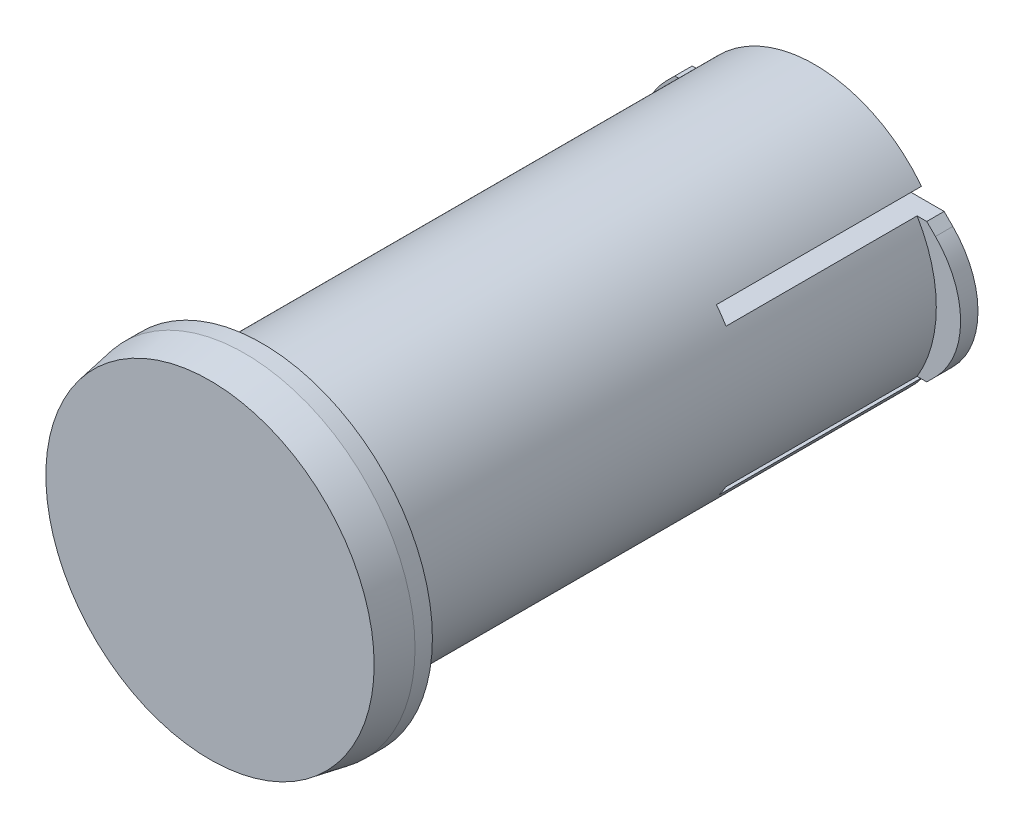
ISO-10303-21;
HEADER;
FILE_DESCRIPTION(('STEP AP214'),'2;1');
FILE_NAME('part.step','',(''),(''),'','','');
FILE_SCHEMA(('AUTOMOTIVE_DESIGN { 1 0 10303 214 1 1 1 1 }'));
ENDSEC;
DATA;
#1=APPLICATION_CONTEXT('core data for automotive mechanical design processes');
#2=APPLICATION_PROTOCOL_DEFINITION('international standard','automotive_design',2000,#1);
#3=PRODUCT_CONTEXT('',#1,'mechanical');
#4=PRODUCT('Part','Part','',(#3));
#5=PRODUCT_RELATED_PRODUCT_CATEGORY('part','',(#4));
#6=PRODUCT_DEFINITION_FORMATION('','',#4);
#7=PRODUCT_DEFINITION_CONTEXT('part definition',#1,'design');
#8=PRODUCT_DEFINITION('design','',#6,#7);
#9=PRODUCT_DEFINITION_SHAPE('','',#8);
#10=(LENGTH_UNIT() NAMED_UNIT(*) SI_UNIT(.MILLI.,.METRE.));
#11=(NAMED_UNIT(*) PLANE_ANGLE_UNIT() SI_UNIT($,.RADIAN.));
#12=(NAMED_UNIT(*) SI_UNIT($,.STERADIAN.) SOLID_ANGLE_UNIT());
#13=UNCERTAINTY_MEASURE_WITH_UNIT(LENGTH_MEASURE(1.E-05),#10,'distance_accuracy_value','');
#14=(GEOMETRIC_REPRESENTATION_CONTEXT(3) GLOBAL_UNCERTAINTY_ASSIGNED_CONTEXT((#13)) GLOBAL_UNIT_ASSIGNED_CONTEXT((#10,
#11,#12)) REPRESENTATION_CONTEXT('',''));
#15=CARTESIAN_POINT('',(0.,0.,0.));
#16=DIRECTION('',(0.,0.,1.));
#17=DIRECTION('',(1.,0.,0.));
#18=AXIS2_PLACEMENT_3D('',#15,#16,#17);
#19=CARTESIAN_POINT('',(0.,0.,-16.));
#20=DIRECTION('',(0.,0.,1.));
#21=DIRECTION('',(1.,0.,0.));
#22=AXIS2_PLACEMENT_3D('',#19,#20,#21);
#23=CYLINDRICAL_SURFACE('',#22,3.9);
#24=DIRECTION('',(0.,0.,1.));
#25=VECTOR('',#24,1.);
#26=CARTESIAN_POINT('',(-3.34813380855664,-2.,-16.));
#27=LINE('',#26,#25);
#28=CARTESIAN_POINT('',(-3.34813380855664,-2.,-10.));
#29=VERTEX_POINT('',#28);
#30=CARTESIAN_POINT('',(-3.34813380855664,-2.,-15.5));
#31=VERTEX_POINT('',#30);
#32=EDGE_CURVE('E269',#29,#31,#27,.F.);
#33=ORIENTED_EDGE('',*,*,#32,.F.);
#34=CARTESIAN_POINT('',(0.,0.,-10.));
#35=DIRECTION('',(0.,0.,-1.));
#36=DIRECTION('',(-1.,0.,0.));
#37=AXIS2_PLACEMENT_3D('',#34,#35,#36);
#38=CIRCLE('',#37,3.9);
#39=CARTESIAN_POINT('',(-3.14960314960473,-2.3,-10.));
#40=VERTEX_POINT('',#39);
#41=EDGE_CURVE('E11',#29,#40,#38,.F.);
#42=ORIENTED_EDGE('',*,*,#41,.T.);
#43=DIRECTION('',(0.,0.,1.));
#44=VECTOR('',#43,1.);
#45=CARTESIAN_POINT('',(-3.14960314960473,-2.3,-16.));
#46=LINE('',#45,#44);
#47=CARTESIAN_POINT('',(-3.14960314960473,-2.3,-15.9));
#48=VERTEX_POINT('',#47);
#49=EDGE_CURVE('E283',#40,#48,#46,.F.);
#50=ORIENTED_EDGE('',*,*,#49,.T.);
#51=CARTESIAN_POINT('',(0.,0.,-15.9));
#52=DIRECTION('',(0.,0.,-1.));
#53=DIRECTION('',(-1.,0.,0.));
#54=AXIS2_PLACEMENT_3D('',#51,#52,#53);
#55=CIRCLE('',#54,3.9);
#56=CARTESIAN_POINT('',(3.14960314960473,-2.3,-15.9));
#57=VERTEX_POINT('',#56);
#58=EDGE_CURVE('E417',#57,#48,#55,.T.);
#59=ORIENTED_EDGE('',*,*,#58,.F.);
#60=DIRECTION('',(0.,0.,1.));
#61=VECTOR('',#60,1.);
#62=CARTESIAN_POINT('',(3.14960314960473,-2.3,-16.));
#63=LINE('',#62,#61);
#64=CARTESIAN_POINT('',(3.14960314960473,-2.3,-10.));
#65=VERTEX_POINT('',#64);
#66=EDGE_CURVE('E363',#65,#57,#63,.F.);
#67=ORIENTED_EDGE('',*,*,#66,.F.);
#68=CARTESIAN_POINT('',(0.,0.,-10.));
#69=DIRECTION('',(0.,0.,-1.));
#70=DIRECTION('',(-1.,0.,0.));
#71=AXIS2_PLACEMENT_3D('',#68,#69,#70);
#72=CIRCLE('',#71,3.9);
#73=CARTESIAN_POINT('',(3.34813380855664,-2.,-10.));
#74=VERTEX_POINT('',#73);
#75=EDGE_CURVE('E447',#65,#74,#72,.F.);
#76=ORIENTED_EDGE('',*,*,#75,.T.);
#77=DIRECTION('',(0.,0.,1.));
#78=VECTOR('',#77,1.);
#79=CARTESIAN_POINT('',(3.34813380855664,-2.,-16.));
#80=LINE('',#79,#78);
#81=CARTESIAN_POINT('',(3.34813380855664,-2.,-15.5));
#82=VERTEX_POINT('',#81);
#83=EDGE_CURVE('E353',#74,#82,#80,.F.);
#84=ORIENTED_EDGE('',*,*,#83,.T.);
#85=CARTESIAN_POINT('',(0.,0.,-15.5));
#86=DIRECTION('',(0.,0.,-1.));
#87=DIRECTION('',(-1.,0.,0.));
#88=AXIS2_PLACEMENT_3D('',#85,#86,#87);
#89=CIRCLE('',#88,3.9);
#90=CARTESIAN_POINT('',(3.34813380855664,2.,-15.5));
#91=VERTEX_POINT('',#90);
#92=EDGE_CURVE('E436',#82,#91,#89,.F.);
#93=ORIENTED_EDGE('',*,*,#92,.T.);
#94=DIRECTION('',(0.,0.,1.));
#95=VECTOR('',#94,1.);
#96=CARTESIAN_POINT('',(3.34813380855664,2.,-16.));
#97=LINE('',#96,#95);
#98=CARTESIAN_POINT('',(3.34813380855664,2.,-10.));
#99=VERTEX_POINT('',#98);
#100=EDGE_CURVE('E349',#99,#91,#97,.F.);
#101=ORIENTED_EDGE('',*,*,#100,.F.);
#102=CARTESIAN_POINT('',(3.07408522978788,2.4,-10.));
#103=VERTEX_POINT('',#102);
#104=EDGE_CURVE('E444',#99,#103,#72,.F.);
#105=ORIENTED_EDGE('',*,*,#104,.T.);
#106=DIRECTION('',(0.,0.,1.));
#107=VECTOR('',#106,1.);
#108=CARTESIAN_POINT('',(3.07408522978788,2.4,-16.));
#109=LINE('',#108,#107);
#110=CARTESIAN_POINT('',(3.07408522978788,2.4,-15.9));
#111=VERTEX_POINT('',#110);
#112=EDGE_CURVE('E365',#103,#111,#109,.F.);
#113=ORIENTED_EDGE('',*,*,#112,.T.);
#114=CARTESIAN_POINT('',(-3.07408522978788,2.4,-15.9));
#115=VERTEX_POINT('',#114);
#116=EDGE_CURVE('E416',#115,#111,#55,.T.);
#117=ORIENTED_EDGE('',*,*,#116,.F.);
#118=DIRECTION('',(0.,0.,1.));
#119=VECTOR('',#118,1.);
#120=CARTESIAN_POINT('',(-3.07408522978788,2.4,-16.));
#121=LINE('',#120,#119);
#122=CARTESIAN_POINT('',(-3.07408522978788,2.4,-10.));
#123=VERTEX_POINT('',#122);
#124=EDGE_CURVE('E281',#123,#115,#121,.F.);
#125=ORIENTED_EDGE('',*,*,#124,.F.);
#126=CARTESIAN_POINT('',(-3.34813380855664,2.,-10.));
#127=VERTEX_POINT('',#126);
#128=EDGE_CURVE('E50',#123,#127,#38,.F.);
#129=ORIENTED_EDGE('',*,*,#128,.T.);
#130=DIRECTION('',(0.,0.,1.));
#131=VECTOR('',#130,1.);
#132=CARTESIAN_POINT('',(-3.34813380855664,2.,-16.));
#133=LINE('',#132,#131);
#134=CARTESIAN_POINT('',(-3.34813380855664,2.,-15.5));
#135=VERTEX_POINT('',#134);
#136=EDGE_CURVE('E272',#127,#135,#133,.F.);
#137=ORIENTED_EDGE('',*,*,#136,.T.);
#138=CARTESIAN_POINT('',(0.,0.,-15.5));
#139=DIRECTION('',(0.,0.,-1.));
#140=DIRECTION('',(-1.,0.,0.));
#141=AXIS2_PLACEMENT_3D('',#138,#139,#140);
#142=CIRCLE('',#141,3.9);
#143=EDGE_CURVE('E448',#135,#31,#142,.F.);
#144=ORIENTED_EDGE('',*,*,#143,.T.);
#145=EDGE_LOOP('',(#33,#42,#50,#59,#67,#76,#84,#93,#101,#105,#113,#117,#125,#129,#137,#144));
#146=FACE_BOUND('',#145,.T.);
#147=CARTESIAN_POINT('',(0.,0.,0.));
#148=DIRECTION('',(0.,0.,1.));
#149=DIRECTION('',(1.,0.,0.));
#150=AXIS2_PLACEMENT_3D('',#147,#148,#149);
#151=CIRCLE('',#150,3.9);
#152=CARTESIAN_POINT('',(3.9,0.,0.));
#153=VERTEX_POINT('',#152);
#154=EDGE_CURVE('E424',#153,#153,#151,.T.);
#155=ORIENTED_EDGE('',*,*,#154,.F.);
#156=EDGE_LOOP('',(#155));
#157=FACE_BOUND('',#156,.T.);
#158=ADVANCED_FACE('F45',(#146,#157),#23,.T.);
#159=CARTESIAN_POINT('',(0.,0.,-15.9));
#160=DIRECTION('',(0.,0.,-1.));
#161=DIRECTION('',(-1.,0.,0.));
#162=AXIS2_PLACEMENT_3D('',#159,#160,#161);
#163=PLANE('',#162);
#164=ORIENTED_EDGE('',*,*,#58,.T.);
#165=DIRECTION('',(1.,0.,0.));
#166=VECTOR('',#165,1.);
#167=CARTESIAN_POINT('',(0.,-2.3,-15.9));
#168=LINE('',#167,#166);
#169=CARTESIAN_POINT('',(-1.2,-2.3,-15.9));
#170=VERTEX_POINT('',#169);
#171=EDGE_CURVE('E451',#48,#170,#168,.T.);
#172=ORIENTED_EDGE('',*,*,#171,.T.);
#173=DIRECTION('',(0.,-1.,0.));
#174=VECTOR('',#173,1.);
#175=CARTESIAN_POINT('',(-1.2,0.,-15.9));
#176=LINE('',#175,#174);
#177=CARTESIAN_POINT('',(-1.2,-1.6,-15.9));
#178=VERTEX_POINT('',#177);
#179=EDGE_CURVE('E277',#178,#170,#176,.T.);
#180=ORIENTED_EDGE('',*,*,#179,.F.);
#181=CARTESIAN_POINT('',(0.,0.,-15.9));
#182=DIRECTION('',(0.,0.,-1.));
#183=DIRECTION('',(-1.,0.,0.));
#184=AXIS2_PLACEMENT_3D('',#181,#182,#183);
#185=CIRCLE('',#184,2.);
#186=CARTESIAN_POINT('',(1.2,-1.6,-15.9));
#187=VERTEX_POINT('',#186);
#188=EDGE_CURVE('E413',#187,#178,#185,.T.);
#189=ORIENTED_EDGE('',*,*,#188,.F.);
#190=DIRECTION('',(0.,-1.,0.));
#191=VECTOR('',#190,1.);
#192=CARTESIAN_POINT('',(1.2,0.,-15.9));
#193=LINE('',#192,#191);
#194=CARTESIAN_POINT('',(1.2,-2.3,-15.9));
#195=VERTEX_POINT('',#194);
#196=EDGE_CURVE('E355',#187,#195,#193,.T.);
#197=ORIENTED_EDGE('',*,*,#196,.T.);
#198=DIRECTION('',(-1.,0.,0.));
#199=VECTOR('',#198,1.);
#200=CARTESIAN_POINT('',(0.,-2.3,-15.9));
#201=LINE('',#200,#199);
#202=EDGE_CURVE('E439',#57,#195,#201,.T.);
#203=ORIENTED_EDGE('',*,*,#202,.F.);
#204=EDGE_LOOP('',(#164,#172,#180,#189,#197,#203));
#205=FACE_BOUND('',#204,.T.);
#206=ADVANCED_FACE('F500',(#205),#163,.T.);
#207=CARTESIAN_POINT('',(0.,0.,-19.1));
#208=DIRECTION('',(0.,0.,1.));
#209=DIRECTION('',(1.,0.,0.));
#210=AXIS2_PLACEMENT_3D('',#207,#208,#209);
#211=CYLINDRICAL_SURFACE('',#210,2.);
#212=CARTESIAN_POINT('',(0.,0.,-16.));
#213=DIRECTION('',(0.,0.,1.));
#214=DIRECTION('',(1.,0.,0.));
#215=AXIS2_PLACEMENT_3D('',#212,#213,#214);
#216=CIRCLE('',#215,2.);
#217=CARTESIAN_POINT('',(-1.2,1.6,-16.));
#218=VERTEX_POINT('',#217);
#219=CARTESIAN_POINT('',(1.2,1.6,-16.));
#220=VERTEX_POINT('',#219);
#221=EDGE_CURVE('E420',#218,#220,#216,.F.);
#222=ORIENTED_EDGE('',*,*,#221,.F.);
#223=DIRECTION('',(0.,0.,1.));
#224=VECTOR('',#223,1.);
#225=CARTESIAN_POINT('',(-1.2,1.6,-19.1));
#226=LINE('',#225,#224);
#227=CARTESIAN_POINT('',(-1.2,1.6,-15.9));
#228=VERTEX_POINT('',#227);
#229=EDGE_CURVE('E61',#218,#228,#226,.T.);
#230=ORIENTED_EDGE('',*,*,#229,.T.);
#231=CARTESIAN_POINT('',(1.2,1.6,-15.9));
#232=VERTEX_POINT('',#231);
#233=EDGE_CURVE('E403',#228,#232,#185,.T.);
#234=ORIENTED_EDGE('',*,*,#233,.T.);
#235=DIRECTION('',(0.,0.,1.));
#236=VECTOR('',#235,1.);
#237=CARTESIAN_POINT('',(1.2,1.6,-19.1));
#238=LINE('',#237,#236);
#239=EDGE_CURVE('E360',#220,#232,#238,.T.);
#240=ORIENTED_EDGE('',*,*,#239,.F.);
#241=EDGE_LOOP('',(#222,#230,#234,#240));
#242=FACE_BOUND('',#241,.T.);
#243=ADVANCED_FACE('F467',(#242),#211,.T.);
#244=CARTESIAN_POINT('',(-1.2,2.4,-15.9));
#245=VERTEX_POINT('',#244);
#246=EDGE_CURVE('E279',#245,#228,#176,.T.);
#247=ORIENTED_EDGE('',*,*,#246,.F.);
#248=DIRECTION('',(1.,0.,0.));
#249=VECTOR('',#248,1.);
#250=CARTESIAN_POINT('',(0.,2.4,-15.9));
#251=LINE('',#250,#249);
#252=EDGE_CURVE('E249',#115,#245,#251,.T.);
#253=ORIENTED_EDGE('',*,*,#252,.F.);
#254=ORIENTED_EDGE('',*,*,#116,.T.);
#255=DIRECTION('',(-1.,0.,0.));
#256=VECTOR('',#255,1.);
#257=CARTESIAN_POINT('',(0.,2.4,-15.9));
#258=LINE('',#257,#256);
#259=CARTESIAN_POINT('',(1.2,2.4,-15.9));
#260=VERTEX_POINT('',#259);
#261=EDGE_CURVE('E441',#111,#260,#258,.T.);
#262=ORIENTED_EDGE('',*,*,#261,.T.);
#263=EDGE_CURVE('E358',#260,#232,#193,.T.);
#264=ORIENTED_EDGE('',*,*,#263,.T.);
#265=ORIENTED_EDGE('',*,*,#233,.F.);
#266=EDGE_LOOP('',(#247,#253,#254,#262,#264,#265));
#267=FACE_BOUND('',#266,.T.);
#268=ADVANCED_FACE('F461',(#267),#163,.T.);
#269=ORIENTED_EDGE('',*,*,#188,.T.);
#270=DIRECTION('',(0.,0.,1.));
#271=VECTOR('',#270,1.);
#272=CARTESIAN_POINT('',(-1.2,-1.6,-19.1));
#273=LINE('',#272,#271);
#274=CARTESIAN_POINT('',(-1.2,-1.6,-16.));
#275=VERTEX_POINT('',#274);
#276=EDGE_CURVE('E274',#178,#275,#273,.F.);
#277=ORIENTED_EDGE('',*,*,#276,.T.);
#278=CARTESIAN_POINT('',(1.2,-1.6,-16.));
#279=VERTEX_POINT('',#278);
#280=EDGE_CURVE('E425',#279,#275,#216,.F.);
#281=ORIENTED_EDGE('',*,*,#280,.F.);
#282=DIRECTION('',(0.,0.,1.));
#283=VECTOR('',#282,1.);
#284=CARTESIAN_POINT('',(1.2,-1.6,-19.1));
#285=LINE('',#284,#283);
#286=EDGE_CURVE('E69',#187,#279,#285,.F.);
#287=ORIENTED_EDGE('',*,*,#286,.F.);
#288=EDGE_LOOP('',(#269,#277,#281,#287));
#289=FACE_BOUND('',#288,.T.);
#290=ADVANCED_FACE('F503',(#289),#211,.T.);
#291=CARTESIAN_POINT('',(0.,0.,-16.));
#292=DIRECTION('',(0.,0.,1.));
#293=DIRECTION('',(1.,0.,0.));
#294=AXIS2_PLACEMENT_3D('',#291,#292,#293);
#295=PLANE('',#294);
#296=ORIENTED_EDGE('',*,*,#280,.T.);
#297=DIRECTION('',(0.,-1.,0.));
#298=VECTOR('',#297,1.);
#299=CARTESIAN_POINT('',(-1.2,2.4,-16.));
#300=LINE('',#299,#298);
#301=EDGE_CURVE('E243',#218,#275,#300,.T.);
#302=ORIENTED_EDGE('',*,*,#301,.F.);
#303=ORIENTED_EDGE('',*,*,#221,.T.);
#304=DIRECTION('',(0.,-1.,0.));
#305=VECTOR('',#304,1.);
#306=CARTESIAN_POINT('',(1.2,2.4,-16.));
#307=LINE('',#306,#305);
#308=EDGE_CURVE('E314',#220,#279,#307,.T.);
#309=ORIENTED_EDGE('',*,*,#308,.T.);
#310=EDGE_LOOP('',(#296,#302,#303,#309));
#311=FACE_BOUND('',#310,.T.);
#312=ADVANCED_FACE('F470',(#311),#295,.F.);
#313=CARTESIAN_POINT('',(0.,0.,1.5));
#314=DIRECTION('',(0.,0.,-1.));
#315=DIRECTION('',(-1.,0.,0.));
#316=AXIS2_PLACEMENT_3D('',#313,#314,#315);
#317=CYLINDRICAL_SURFACE('',#316,4.9);
#318=CARTESIAN_POINT('',(0.,0.,0.499999999999933));
#319=DIRECTION('',(0.,0.,1.));
#320=DIRECTION('',(1.,0.,0.));
#321=AXIS2_PLACEMENT_3D('',#318,#319,#320);
#322=CIRCLE('',#321,4.9);
#323=CARTESIAN_POINT('',(4.9,0.,0.499999999999933));
#324=VERTEX_POINT('',#323);
#325=EDGE_CURVE('E433',#324,#324,#322,.F.);
#326=ORIENTED_EDGE('',*,*,#325,.T.);
#327=EDGE_LOOP('',(#326));
#328=FACE_BOUND('',#327,.T.);
#329=CARTESIAN_POINT('',(0.,0.,0.));
#330=DIRECTION('',(0.,0.,1.));
#331=DIRECTION('',(1.,0.,0.));
#332=AXIS2_PLACEMENT_3D('',#329,#330,#331);
#333=CIRCLE('',#332,4.9);
#334=CARTESIAN_POINT('',(4.9,0.,0.));
#335=VERTEX_POINT('',#334);
#336=EDGE_CURVE('E421',#335,#335,#333,.T.);
#337=ORIENTED_EDGE('',*,*,#336,.T.);
#338=EDGE_LOOP('',(#337));
#339=FACE_BOUND('',#338,.T.);
#340=ADVANCED_FACE('F556',(#328,#339),#317,.T.);
#341=CARTESIAN_POINT('',(0.,0.,1.5));
#342=DIRECTION('',(0.,0.,1.));
#343=DIRECTION('',(1.,0.,0.));
#344=AXIS2_PLACEMENT_3D('',#341,#342,#343);
#345=PLANE('',#344);
#346=CARTESIAN_POINT('',(0.,0.,1.5));
#347=DIRECTION('',(0.,0.,1.));
#348=DIRECTION('',(1.,0.,0.));
#349=AXIS2_PLACEMENT_3D('',#346,#347,#348);
#350=CIRCLE('',#349,4.72367301929153);
#351=CARTESIAN_POINT('',(4.72367301929153,0.,1.5));
#352=VERTEX_POINT('',#351);
#353=EDGE_CURVE('E428',#352,#352,#350,.T.);
#354=ORIENTED_EDGE('',*,*,#353,.T.);
#355=EDGE_LOOP('',(#354));
#356=FACE_BOUND('',#355,.T.);
#357=ADVANCED_FACE('F559',(#356),#345,.T.);
#358=CARTESIAN_POINT('',(0.,0.,0.));
#359=DIRECTION('',(0.,0.,1.));
#360=DIRECTION('',(1.,0.,0.));
#361=AXIS2_PLACEMENT_3D('',#358,#359,#360);
#362=PLANE('',#361);
#363=ORIENTED_EDGE('',*,*,#154,.T.);
#364=EDGE_LOOP('',(#363));
#365=FACE_BOUND('',#364,.T.);
#366=ORIENTED_EDGE('',*,*,#336,.F.);
#367=EDGE_LOOP('',(#366));
#368=FACE_BOUND('',#367,.T.);
#369=ADVANCED_FACE('F561',(#365,#368),#362,.F.);
#370=CARTESIAN_POINT('',(0.,0.,1.5));
#371=DIRECTION('',(0.,0.,-1.));
#372=DIRECTION('',(-1.,0.,0.));
#373=AXIS2_PLACEMENT_3D('',#370,#371,#372);
#374=CONICAL_SURFACE('',#373,4.72367301929153,0.17453292519943);
#375=ORIENTED_EDGE('',*,*,#325,.F.);
#376=EDGE_LOOP('',(#375));
#377=FACE_BOUND('',#376,.T.);
#378=ORIENTED_EDGE('',*,*,#353,.F.);
#379=EDGE_LOOP('',(#378));
#380=FACE_BOUND('',#379,.T.);
#381=ADVANCED_FACE('F48',(#377,#380),#374,.T.);
#382=CARTESIAN_POINT('',(2.1,2.,-15.5));
#383=DIRECTION('',(-1.,0.,0.));
#384=DIRECTION('',(0.,-1.,0.));
#385=AXIS2_PLACEMENT_3D('',#382,#383,#384);
#386=PLANE('',#385);
#387=DIRECTION('',(0.,0.,-1.));
#388=VECTOR('',#387,1.);
#389=CARTESIAN_POINT('',(2.1,-2.,-15.5));
#390=LINE('',#389,#388);
#391=CARTESIAN_POINT('',(2.1,-2.,-10.));
#392=VERTEX_POINT('',#391);
#393=CARTESIAN_POINT('',(2.1,-2.,-16.));
#394=VERTEX_POINT('',#393);
#395=EDGE_CURVE('E401',#392,#394,#390,.T.);
#396=ORIENTED_EDGE('',*,*,#395,.F.);
#397=DIRECTION('',(0.,-1.,0.));
#398=VECTOR('',#397,1.);
#399=CARTESIAN_POINT('',(2.1,2.,-10.));
#400=LINE('',#399,#398);
#401=CARTESIAN_POINT('',(2.1,2.,-10.));
#402=VERTEX_POINT('',#401);
#403=EDGE_CURVE('E331',#402,#392,#400,.T.);
#404=ORIENTED_EDGE('',*,*,#403,.F.);
#405=DIRECTION('',(0.,0.,-1.));
#406=VECTOR('',#405,1.);
#407=CARTESIAN_POINT('',(2.1,2.,-15.5));
#408=LINE('',#407,#406);
#409=CARTESIAN_POINT('',(2.1,2.,-16.));
#410=VERTEX_POINT('',#409);
#411=EDGE_CURVE('E384',#402,#410,#408,.T.);
#412=ORIENTED_EDGE('',*,*,#411,.T.);
#413=DIRECTION('',(0.,1.,0.));
#414=VECTOR('',#413,1.);
#415=CARTESIAN_POINT('',(2.1,2.,-16.));
#416=LINE('',#415,#414);
#417=EDGE_CURVE('E368',#394,#410,#416,.T.);
#418=ORIENTED_EDGE('',*,*,#417,.F.);
#419=EDGE_LOOP('',(#396,#404,#412,#418));
#420=FACE_BOUND('',#419,.T.);
#421=ADVANCED_FACE('F488',(#420),#386,.T.);
#422=CARTESIAN_POINT('',(3.62512626584708,-2.,-15.5));
#423=DIRECTION('',(0.,-1.,0.));
#424=DIRECTION('',(1.,0.,0.));
#425=AXIS2_PLACEMENT_3D('',#422,#423,#424);
#426=PLANE('',#425);
#427=DIRECTION('',(-1.,0.,0.));
#428=VECTOR('',#427,1.);
#429=CARTESIAN_POINT('',(3.62512626584708,-2.,-15.5));
#430=LINE('',#429,#428);
#431=CARTESIAN_POINT('',(3.62512626584708,-2.,-15.5));
#432=VERTEX_POINT('',#431);
#433=EDGE_CURVE('E381',#432,#82,#430,.T.);
#434=ORIENTED_EDGE('',*,*,#433,.T.);
#435=ORIENTED_EDGE('',*,*,#83,.F.);
#436=DIRECTION('',(-1.,0.,0.));
#437=VECTOR('',#436,1.);
#438=CARTESIAN_POINT('',(3.62512626584708,-2.,-10.));
#439=LINE('',#438,#437);
#440=EDGE_CURVE('E334',#74,#392,#439,.T.);
#441=ORIENTED_EDGE('',*,*,#440,.T.);
#442=ORIENTED_EDGE('',*,*,#395,.T.);
#443=DIRECTION('',(-1.,0.,0.));
#444=VECTOR('',#443,1.);
#445=CARTESIAN_POINT('',(3.62512626584708,-2.,-16.));
#446=LINE('',#445,#444);
#447=CARTESIAN_POINT('',(3.62512626584708,-2.,-16.));
#448=VERTEX_POINT('',#447);
#449=EDGE_CURVE('E372',#448,#394,#446,.T.);
#450=ORIENTED_EDGE('',*,*,#449,.F.);
#451=DIRECTION('',(0.,0.,-1.));
#452=VECTOR('',#451,1.);
#453=CARTESIAN_POINT('',(3.62512626584708,-2.,-15.5));
#454=LINE('',#453,#452);
#455=EDGE_CURVE('E404',#432,#448,#454,.T.);
#456=ORIENTED_EDGE('',*,*,#455,.F.);
#457=EDGE_LOOP('',(#434,#435,#441,#442,#450,#456));
#458=FACE_BOUND('',#457,.T.);
#459=ADVANCED_FACE('F573',(#458),#426,.T.);
#460=CARTESIAN_POINT('',(3.62512626584708,-2.,-15.5));
#461=DIRECTION('',(0.707106781186544,-0.707106781186551,0.));
#462=DIRECTION('',(0.707106781186551,0.707106781186544,0.));
#463=AXIS2_PLACEMENT_3D('',#460,#461,#462);
#464=PLANE('',#463);
#465=DIRECTION('',(-0.707106781186551,-0.707106781186544,0.));
#466=VECTOR('',#465,1.);
#467=CARTESIAN_POINT('',(3.62512626584708,-2.,-16.));
#468=LINE('',#467,#466);
#469=CARTESIAN_POINT('',(3.87512626584708,-1.75,-16.));
#470=VERTEX_POINT('',#469);
#471=EDGE_CURVE('E396',#470,#448,#468,.T.);
#472=ORIENTED_EDGE('',*,*,#471,.F.);
#473=DIRECTION('',(0.,0.,-1.));
#474=VECTOR('',#473,1.);
#475=CARTESIAN_POINT('',(3.87512626584708,-1.75,-15.5));
#476=LINE('',#475,#474);
#477=CARTESIAN_POINT('',(3.87512626584708,-1.75,-15.5));
#478=VERTEX_POINT('',#477);
#479=EDGE_CURVE('E406',#478,#470,#476,.T.);
#480=ORIENTED_EDGE('',*,*,#479,.F.);
#481=DIRECTION('',(-0.707106781186551,-0.707106781186544,0.));
#482=VECTOR('',#481,1.);
#483=CARTESIAN_POINT('',(3.62512626584708,-2.,-15.5));
#484=LINE('',#483,#482);
#485=EDGE_CURVE('E378',#478,#432,#484,.T.);
#486=ORIENTED_EDGE('',*,*,#485,.T.);
#487=ORIENTED_EDGE('',*,*,#455,.T.);
#488=EDGE_LOOP('',(#472,#480,#486,#487));
#489=FACE_BOUND('',#488,.T.);
#490=ADVANCED_FACE('F584',(#489),#464,.T.);
#491=CARTESIAN_POINT('',(2.12512626584708,0.,-15.5));
#492=DIRECTION('',(0.,0.,-1.));
#493=DIRECTION('',(-1.,0.,0.));
#494=AXIS2_PLACEMENT_3D('',#491,#492,#493);
#495=CYLINDRICAL_SURFACE('',#494,2.47487373415292);
#496=CARTESIAN_POINT('',(2.12512626584708,0.,-16.));
#497=DIRECTION('',(0.,0.,-1.));
#498=DIRECTION('',(-1.,0.,0.));
#499=AXIS2_PLACEMENT_3D('',#496,#497,#498);
#500=CIRCLE('',#499,2.47487373415292);
#501=CARTESIAN_POINT('',(3.87512626584709,1.75,-16.));
#502=VERTEX_POINT('',#501);
#503=EDGE_CURVE('E393',#502,#470,#500,.T.);
#504=ORIENTED_EDGE('',*,*,#503,.F.);
#505=DIRECTION('',(0.,0.,-1.));
#506=VECTOR('',#505,1.);
#507=CARTESIAN_POINT('',(3.87512626584709,1.75,-15.5));
#508=LINE('',#507,#506);
#509=CARTESIAN_POINT('',(3.87512626584709,1.75,-15.5));
#510=VERTEX_POINT('',#509);
#511=EDGE_CURVE('E408',#510,#502,#508,.T.);
#512=ORIENTED_EDGE('',*,*,#511,.F.);
#513=CARTESIAN_POINT('',(2.12512626584708,0.,-15.5));
#514=DIRECTION('',(0.,0.,-1.));
#515=DIRECTION('',(-1.,0.,0.));
#516=AXIS2_PLACEMENT_3D('',#513,#514,#515);
#517=CIRCLE('',#516,2.47487373415292);
#518=EDGE_CURVE('E375',#510,#478,#517,.T.);
#519=ORIENTED_EDGE('',*,*,#518,.T.);
#520=ORIENTED_EDGE('',*,*,#479,.T.);
#521=EDGE_LOOP('',(#504,#512,#519,#520));
#522=FACE_BOUND('',#521,.T.);
#523=ADVANCED_FACE('F580',(#522),#495,.T.);
#524=CARTESIAN_POINT('',(3.62512626584709,2.,-15.5));
#525=DIRECTION('',(0.707106781186551,0.707106781186544,0.));
#526=DIRECTION('',(-0.707106781186544,0.707106781186551,0.));
#527=AXIS2_PLACEMENT_3D('',#524,#525,#526);
#528=PLANE('',#527);
#529=DIRECTION('',(0.707106781186544,-0.707106781186551,0.));
#530=VECTOR('',#529,1.);
#531=CARTESIAN_POINT('',(3.62512626584709,2.,-16.));
#532=LINE('',#531,#530);
#533=CARTESIAN_POINT('',(3.62512626584709,2.,-16.));
#534=VERTEX_POINT('',#533);
#535=EDGE_CURVE('E390',#534,#502,#532,.T.);
#536=ORIENTED_EDGE('',*,*,#535,.F.);
#537=DIRECTION('',(0.,0.,-1.));
#538=VECTOR('',#537,1.);
#539=CARTESIAN_POINT('',(3.62512626584709,2.,-15.5));
#540=LINE('',#539,#538);
#541=CARTESIAN_POINT('',(3.62512626584709,2.,-15.5));
#542=VERTEX_POINT('',#541);
#543=EDGE_CURVE('E410',#542,#534,#540,.T.);
#544=ORIENTED_EDGE('',*,*,#543,.F.);
#545=DIRECTION('',(0.707106781186544,-0.707106781186551,0.));
#546=VECTOR('',#545,1.);
#547=CARTESIAN_POINT('',(3.62512626584709,2.,-15.5));
#548=LINE('',#547,#546);
#549=EDGE_CURVE('E371',#542,#510,#548,.T.);
#550=ORIENTED_EDGE('',*,*,#549,.T.);
#551=ORIENTED_EDGE('',*,*,#511,.T.);
#552=EDGE_LOOP('',(#536,#544,#550,#551));
#553=FACE_BOUND('',#552,.T.);
#554=ADVANCED_FACE('F577',(#553),#528,.T.);
#555=CARTESIAN_POINT('',(3.62512626584709,2.,-15.5));
#556=DIRECTION('',(0.,1.,0.));
#557=DIRECTION('',(0.,0.,1.));
#558=AXIS2_PLACEMENT_3D('',#555,#556,#557);
#559=PLANE('',#558);
#560=ORIENTED_EDGE('',*,*,#100,.T.);
#561=DIRECTION('',(1.,0.,0.));
#562=VECTOR('',#561,1.);
#563=CARTESIAN_POINT('',(3.62512626584709,2.,-15.5));
#564=LINE('',#563,#562);
#565=EDGE_CURVE('E369',#91,#542,#564,.T.);
#566=ORIENTED_EDGE('',*,*,#565,.T.);
#567=ORIENTED_EDGE('',*,*,#543,.T.);
#568=DIRECTION('',(1.,0.,0.));
#569=VECTOR('',#568,1.);
#570=CARTESIAN_POINT('',(3.62512626584709,2.,-16.));
#571=LINE('',#570,#569);
#572=EDGE_CURVE('E387',#410,#534,#571,.T.);
#573=ORIENTED_EDGE('',*,*,#572,.F.);
#574=ORIENTED_EDGE('',*,*,#411,.F.);
#575=DIRECTION('',(-1.,0.,0.));
#576=VECTOR('',#575,1.);
#577=CARTESIAN_POINT('',(3.62512626584709,2.,-10.));
#578=LINE('',#577,#576);
#579=EDGE_CURVE('E328',#99,#402,#578,.T.);
#580=ORIENTED_EDGE('',*,*,#579,.F.);
#581=EDGE_LOOP('',(#560,#566,#567,#573,#574,#580));
#582=FACE_BOUND('',#581,.T.);
#583=ADVANCED_FACE('F484',(#582),#559,.T.);
#584=CARTESIAN_POINT('',(2.12512626584708,0.,-15.5));
#585=DIRECTION('',(0.,0.,-1.));
#586=DIRECTION('',(-1.,0.,0.));
#587=AXIS2_PLACEMENT_3D('',#584,#585,#586);
#588=PLANE('',#587);
#589=ORIENTED_EDGE('',*,*,#92,.F.);
#590=ORIENTED_EDGE('',*,*,#433,.F.);
#591=ORIENTED_EDGE('',*,*,#485,.F.);
#592=ORIENTED_EDGE('',*,*,#518,.F.);
#593=ORIENTED_EDGE('',*,*,#549,.F.);
#594=ORIENTED_EDGE('',*,*,#565,.F.);
#595=EDGE_LOOP('',(#589,#590,#591,#592,#593,#594));
#596=FACE_BOUND('',#595,.T.);
#597=ADVANCED_FACE('F576',(#596),#588,.F.);
#598=CARTESIAN_POINT('',(2.12512626584708,0.,-16.));
#599=DIRECTION('',(0.,0.,-1.));
#600=DIRECTION('',(-1.,0.,0.));
#601=AXIS2_PLACEMENT_3D('',#598,#599,#600);
#602=PLANE('',#601);
#603=ORIENTED_EDGE('',*,*,#417,.T.);
#604=ORIENTED_EDGE('',*,*,#572,.T.);
#605=ORIENTED_EDGE('',*,*,#535,.T.);
#606=ORIENTED_EDGE('',*,*,#503,.T.);
#607=ORIENTED_EDGE('',*,*,#471,.T.);
#608=ORIENTED_EDGE('',*,*,#449,.T.);
#609=EDGE_LOOP('',(#603,#604,#605,#606,#607,#608));
#610=FACE_BOUND('',#609,.T.);
#611=ADVANCED_FACE('F591',(#610),#602,.T.);
#612=CARTESIAN_POINT('',(1.2,2.4,-10.));
#613=DIRECTION('',(1.,0.,0.));
#614=DIRECTION('',(0.,1.,0.));
#615=AXIS2_PLACEMENT_3D('',#612,#613,#614);
#616=PLANE('',#615);
#617=ORIENTED_EDGE('',*,*,#239,.T.);
#618=ORIENTED_EDGE('',*,*,#263,.F.);
#619=DIRECTION('',(0.,0.,-1.));
#620=VECTOR('',#619,1.);
#621=CARTESIAN_POINT('',(1.2,2.4,-10.));
#622=LINE('',#621,#620);
#623=CARTESIAN_POINT('',(1.2,2.4,-10.));
#624=VERTEX_POINT('',#623);
#625=EDGE_CURVE('E346',#624,#260,#622,.T.);
#626=ORIENTED_EDGE('',*,*,#625,.F.);
#627=DIRECTION('',(0.,-1.,0.));
#628=VECTOR('',#627,1.);
#629=CARTESIAN_POINT('',(1.2,2.4,-10.));
#630=LINE('',#629,#628);
#631=CARTESIAN_POINT('',(1.2,-2.3,-10.));
#632=VERTEX_POINT('',#631);
#633=EDGE_CURVE('E339',#624,#632,#630,.T.);
#634=ORIENTED_EDGE('',*,*,#633,.T.);
#635=DIRECTION('',(0.,0.,-1.));
#636=VECTOR('',#635,1.);
#637=CARTESIAN_POINT('',(1.2,-2.3,-10.));
#638=LINE('',#637,#636);
#639=EDGE_CURVE('E344',#632,#195,#638,.T.);
#640=ORIENTED_EDGE('',*,*,#639,.T.);
#641=ORIENTED_EDGE('',*,*,#196,.F.);
#642=ORIENTED_EDGE('',*,*,#286,.T.);
#643=ORIENTED_EDGE('',*,*,#308,.F.);
#644=EDGE_LOOP('',(#617,#618,#626,#634,#640,#641,#642,#643));
#645=FACE_BOUND('',#644,.T.);
#646=ADVANCED_FACE('F472',(#645),#616,.T.);
#647=CARTESIAN_POINT('',(3.62512626584709,2.4,-10.));
#648=DIRECTION('',(0.,-1.,0.));
#649=DIRECTION('',(0.,0.,-1.));
#650=AXIS2_PLACEMENT_3D('',#647,#648,#649);
#651=PLANE('',#650);
#652=DIRECTION('',(-1.,0.,0.));
#653=VECTOR('',#652,1.);
#654=CARTESIAN_POINT('',(3.62512626584709,2.4,-10.));
#655=LINE('',#654,#653);
#656=EDGE_CURVE('E342',#103,#624,#655,.T.);
#657=ORIENTED_EDGE('',*,*,#656,.T.);
#658=ORIENTED_EDGE('',*,*,#625,.T.);
#659=ORIENTED_EDGE('',*,*,#261,.F.);
#660=ORIENTED_EDGE('',*,*,#112,.F.);
#661=EDGE_LOOP('',(#657,#658,#659,#660));
#662=FACE_BOUND('',#661,.T.);
#663=ADVANCED_FACE('F475',(#662),#651,.T.);
#664=CARTESIAN_POINT('',(3.62512626584709,-2.3,-10.));
#665=DIRECTION('',(0.,-1.,0.));
#666=DIRECTION('',(0.,0.,-1.));
#667=AXIS2_PLACEMENT_3D('',#664,#665,#666);
#668=PLANE('',#667);
#669=ORIENTED_EDGE('',*,*,#66,.T.);
#670=ORIENTED_EDGE('',*,*,#202,.T.);
#671=ORIENTED_EDGE('',*,*,#639,.F.);
#672=DIRECTION('',(-1.,0.,0.));
#673=VECTOR('',#672,1.);
#674=CARTESIAN_POINT('',(3.62512626584709,-2.3,-10.));
#675=LINE('',#674,#673);
#676=EDGE_CURVE('E337',#65,#632,#675,.T.);
#677=ORIENTED_EDGE('',*,*,#676,.F.);
#678=EDGE_LOOP('',(#669,#670,#671,#677));
#679=FACE_BOUND('',#678,.T.);
#680=ADVANCED_FACE('F498',(#679),#668,.F.);
#681=CARTESIAN_POINT('',(0.,0.,-10.));
#682=DIRECTION('',(0.,0.,-1.));
#683=DIRECTION('',(-1.,0.,0.));
#684=AXIS2_PLACEMENT_3D('',#681,#682,#683);
#685=PLANE('',#684);
#686=ORIENTED_EDGE('',*,*,#676,.T.);
#687=ORIENTED_EDGE('',*,*,#633,.F.);
#688=ORIENTED_EDGE('',*,*,#656,.F.);
#689=ORIENTED_EDGE('',*,*,#104,.F.);
#690=ORIENTED_EDGE('',*,*,#579,.T.);
#691=ORIENTED_EDGE('',*,*,#403,.T.);
#692=ORIENTED_EDGE('',*,*,#440,.F.);
#693=ORIENTED_EDGE('',*,*,#75,.F.);
#694=EDGE_LOOP('',(#686,#687,#688,#689,#690,#691,#692,#693));
#695=FACE_BOUND('',#694,.T.);
#696=ADVANCED_FACE('F480',(#695),#685,.T.);
#697=CARTESIAN_POINT('',(-2.1,2.,-15.5));
#698=DIRECTION('',(-1.,0.,0.));
#699=DIRECTION('',(0.,-1.,0.));
#700=AXIS2_PLACEMENT_3D('',#697,#698,#699);
#701=PLANE('',#700);
#702=DIRECTION('',(0.,0.,-1.));
#703=VECTOR('',#702,1.);
#704=CARTESIAN_POINT('',(-2.1,2.,-15.5));
#705=LINE('',#704,#703);
#706=CARTESIAN_POINT('',(-2.1,2.,-10.));
#707=VERTEX_POINT('',#706);
#708=CARTESIAN_POINT('',(-2.1,2.,-16.));
#709=VERTEX_POINT('',#708);
#710=EDGE_CURVE('E312',#707,#709,#705,.T.);
#711=ORIENTED_EDGE('',*,*,#710,.F.);
#712=DIRECTION('',(0.,-1.,0.));
#713=VECTOR('',#712,1.);
#714=CARTESIAN_POINT('',(-2.1,2.,-10.));
#715=LINE('',#714,#713);
#716=CARTESIAN_POINT('',(-2.1,-2.,-10.));
#717=VERTEX_POINT('',#716);
#718=EDGE_CURVE('E263',#707,#717,#715,.T.);
#719=ORIENTED_EDGE('',*,*,#718,.T.);
#720=DIRECTION('',(0.,0.,-1.));
#721=VECTOR('',#720,1.);
#722=CARTESIAN_POINT('',(-2.1,-2.,-15.5));
#723=LINE('',#722,#721);
#724=CARTESIAN_POINT('',(-2.1,-2.,-16.));
#725=VERTEX_POINT('',#724);
#726=EDGE_CURVE('E299',#717,#725,#723,.T.);
#727=ORIENTED_EDGE('',*,*,#726,.T.);
#728=DIRECTION('',(0.,1.,0.));
#729=VECTOR('',#728,1.);
#730=CARTESIAN_POINT('',(-2.1,2.,-16.));
#731=LINE('',#730,#729);
#732=EDGE_CURVE('E286',#725,#709,#731,.T.);
#733=ORIENTED_EDGE('',*,*,#732,.T.);
#734=EDGE_LOOP('',(#711,#719,#727,#733));
#735=FACE_BOUND('',#734,.T.);
#736=ADVANCED_FACE('F528',(#735),#701,.F.);
#737=CARTESIAN_POINT('',(-3.62512626584709,2.,-15.5));
#738=DIRECTION('',(0.,-1.,0.));
#739=DIRECTION('',(0.,0.,-1.));
#740=AXIS2_PLACEMENT_3D('',#737,#738,#739);
#741=PLANE('',#740);
#742=DIRECTION('',(-1.,0.,0.));
#743=VECTOR('',#742,1.);
#744=CARTESIAN_POINT('',(-3.62512626584709,2.,-15.5));
#745=LINE('',#744,#743);
#746=CARTESIAN_POINT('',(-3.62512626584709,2.,-15.5));
#747=VERTEX_POINT('',#746);
#748=EDGE_CURVE('E297',#135,#747,#745,.T.);
#749=ORIENTED_EDGE('',*,*,#748,.F.);
#750=ORIENTED_EDGE('',*,*,#136,.F.);
#751=DIRECTION('',(1.,0.,0.));
#752=VECTOR('',#751,1.);
#753=CARTESIAN_POINT('',(-3.62512626584709,2.,-10.));
#754=LINE('',#753,#752);
#755=EDGE_CURVE('E252',#127,#707,#754,.T.);
#756=ORIENTED_EDGE('',*,*,#755,.T.);
#757=ORIENTED_EDGE('',*,*,#710,.T.);
#758=DIRECTION('',(-1.,0.,0.));
#759=VECTOR('',#758,1.);
#760=CARTESIAN_POINT('',(-3.62512626584709,2.,-16.));
#761=LINE('',#760,#759);
#762=CARTESIAN_POINT('',(-3.62512626584709,2.,-16.));
#763=VERTEX_POINT('',#762);
#764=EDGE_CURVE('E291',#709,#763,#761,.T.);
#765=ORIENTED_EDGE('',*,*,#764,.T.);
#766=DIRECTION('',(0.,0.,-1.));
#767=VECTOR('',#766,1.);
#768=CARTESIAN_POINT('',(-3.62512626584709,2.,-15.5));
#769=LINE('',#768,#767);
#770=EDGE_CURVE('E315',#747,#763,#769,.T.);
#771=ORIENTED_EDGE('',*,*,#770,.F.);
#772=EDGE_LOOP('',(#749,#750,#756,#757,#765,#771));
#773=FACE_BOUND('',#772,.T.);
#774=ADVANCED_FACE('F531',(#773),#741,.F.);
#775=CARTESIAN_POINT('',(-3.62512626584709,2.,-15.5));
#776=DIRECTION('',(0.707106781186551,-0.707106781186544,0.));
#777=DIRECTION('',(0.707106781186544,0.707106781186551,0.));
#778=AXIS2_PLACEMENT_3D('',#775,#776,#777);
#779=PLANE('',#778);
#780=DIRECTION('',(-0.707106781186544,-0.707106781186551,0.));
#781=VECTOR('',#780,1.);
#782=CARTESIAN_POINT('',(-3.62512626584709,2.,-16.));
#783=LINE('',#782,#781);
#784=CARTESIAN_POINT('',(-3.87512626584709,1.75,-16.));
#785=VERTEX_POINT('',#784);
#786=EDGE_CURVE('E309',#763,#785,#783,.T.);
#787=ORIENTED_EDGE('',*,*,#786,.T.);
#788=DIRECTION('',(0.,0.,-1.));
#789=VECTOR('',#788,1.);
#790=CARTESIAN_POINT('',(-3.87512626584709,1.75,-15.5));
#791=LINE('',#790,#789);
#792=CARTESIAN_POINT('',(-3.87512626584709,1.75,-15.5));
#793=VERTEX_POINT('',#792);
#794=EDGE_CURVE('E318',#793,#785,#791,.T.);
#795=ORIENTED_EDGE('',*,*,#794,.F.);
#796=DIRECTION('',(-0.707106781186544,-0.707106781186551,0.));
#797=VECTOR('',#796,1.);
#798=CARTESIAN_POINT('',(-3.62512626584709,2.,-15.5));
#799=LINE('',#798,#797);
#800=EDGE_CURVE('E295',#747,#793,#799,.T.);
#801=ORIENTED_EDGE('',*,*,#800,.F.);
#802=ORIENTED_EDGE('',*,*,#770,.T.);
#803=EDGE_LOOP('',(#787,#795,#801,#802));
#804=FACE_BOUND('',#803,.T.);
#805=ADVANCED_FACE('F536',(#804),#779,.F.);
#806=CARTESIAN_POINT('',(-2.12512626584708,0.,-15.5));
#807=DIRECTION('',(0.,0.,-1.));
#808=DIRECTION('',(-1.,0.,0.));
#809=AXIS2_PLACEMENT_3D('',#806,#807,#808);
#810=CYLINDRICAL_SURFACE('',#809,2.47487373415292);
#811=CARTESIAN_POINT('',(-2.12512626584708,0.,-16.));
#812=DIRECTION('',(0.,0.,1.));
#813=DIRECTION('',(1.,0.,0.));
#814=AXIS2_PLACEMENT_3D('',#811,#812,#813);
#815=CIRCLE('',#814,2.47487373415292);
#816=CARTESIAN_POINT('',(-3.87512626584708,-1.75,-16.));
#817=VERTEX_POINT('',#816);
#818=EDGE_CURVE('E307',#785,#817,#815,.T.);
#819=ORIENTED_EDGE('',*,*,#818,.T.);
#820=DIRECTION('',(0.,0.,-1.));
#821=VECTOR('',#820,1.);
#822=CARTESIAN_POINT('',(-3.87512626584708,-1.75,-15.5));
#823=LINE('',#822,#821);
#824=CARTESIAN_POINT('',(-3.87512626584708,-1.75,-15.5));
#825=VERTEX_POINT('',#824);
#826=EDGE_CURVE('E321',#825,#817,#823,.T.);
#827=ORIENTED_EDGE('',*,*,#826,.F.);
#828=CARTESIAN_POINT('',(-2.12512626584708,0.,-15.5));
#829=DIRECTION('',(0.,0.,1.));
#830=DIRECTION('',(1.,0.,0.));
#831=AXIS2_PLACEMENT_3D('',#828,#829,#830);
#832=CIRCLE('',#831,2.47487373415292);
#833=EDGE_CURVE('E293',#793,#825,#832,.T.);
#834=ORIENTED_EDGE('',*,*,#833,.F.);
#835=ORIENTED_EDGE('',*,*,#794,.T.);
#836=EDGE_LOOP('',(#819,#827,#834,#835));
#837=FACE_BOUND('',#836,.T.);
#838=ADVANCED_FACE('F538',(#837),#810,.T.);
#839=CARTESIAN_POINT('',(-3.62512626584708,-2.,-15.5));
#840=DIRECTION('',(0.707106781186544,0.707106781186551,0.));
#841=DIRECTION('',(-0.707106781186551,0.707106781186544,0.));
#842=AXIS2_PLACEMENT_3D('',#839,#840,#841);
#843=PLANE('',#842);
#844=DIRECTION('',(0.707106781186551,-0.707106781186544,0.));
#845=VECTOR('',#844,1.);
#846=CARTESIAN_POINT('',(-3.62512626584708,-2.,-16.));
#847=LINE('',#846,#845);
#848=CARTESIAN_POINT('',(-3.62512626584708,-2.,-16.));
#849=VERTEX_POINT('',#848);
#850=EDGE_CURVE('E305',#817,#849,#847,.T.);
#851=ORIENTED_EDGE('',*,*,#850,.T.);
#852=DIRECTION('',(0.,0.,-1.));
#853=VECTOR('',#852,1.);
#854=CARTESIAN_POINT('',(-3.62512626584708,-2.,-15.5));
#855=LINE('',#854,#853);
#856=CARTESIAN_POINT('',(-3.62512626584708,-2.,-15.5));
#857=VERTEX_POINT('',#856);
#858=EDGE_CURVE('E324',#857,#849,#855,.T.);
#859=ORIENTED_EDGE('',*,*,#858,.F.);
#860=DIRECTION('',(0.707106781186551,-0.707106781186544,0.));
#861=VECTOR('',#860,1.);
#862=CARTESIAN_POINT('',(-3.62512626584708,-2.,-15.5));
#863=LINE('',#862,#861);
#864=EDGE_CURVE('E290',#825,#857,#863,.T.);
#865=ORIENTED_EDGE('',*,*,#864,.F.);
#866=ORIENTED_EDGE('',*,*,#826,.T.);
#867=EDGE_LOOP('',(#851,#859,#865,#866));
#868=FACE_BOUND('',#867,.T.);
#869=ADVANCED_FACE('F518',(#868),#843,.F.);
#870=CARTESIAN_POINT('',(-3.62512626584708,-2.,-15.5));
#871=DIRECTION('',(0.,1.,0.));
#872=DIRECTION('',(-1.,0.,0.));
#873=AXIS2_PLACEMENT_3D('',#870,#871,#872);
#874=PLANE('',#873);
#875=ORIENTED_EDGE('',*,*,#32,.T.);
#876=DIRECTION('',(1.,0.,0.));
#877=VECTOR('',#876,1.);
#878=CARTESIAN_POINT('',(-3.62512626584708,-2.,-15.5));
#879=LINE('',#878,#877);
#880=EDGE_CURVE('E287',#857,#31,#879,.T.);
#881=ORIENTED_EDGE('',*,*,#880,.F.);
#882=ORIENTED_EDGE('',*,*,#858,.T.);
#883=DIRECTION('',(1.,0.,0.));
#884=VECTOR('',#883,1.);
#885=CARTESIAN_POINT('',(-3.62512626584708,-2.,-16.));
#886=LINE('',#885,#884);
#887=EDGE_CURVE('E302',#849,#725,#886,.T.);
#888=ORIENTED_EDGE('',*,*,#887,.T.);
#889=ORIENTED_EDGE('',*,*,#726,.F.);
#890=DIRECTION('',(1.,0.,0.));
#891=VECTOR('',#890,1.);
#892=CARTESIAN_POINT('',(-3.62512626584708,-2.,-10.));
#893=LINE('',#892,#891);
#894=EDGE_CURVE('E259',#29,#717,#893,.T.);
#895=ORIENTED_EDGE('',*,*,#894,.F.);
#896=EDGE_LOOP('',(#875,#881,#882,#888,#889,#895));
#897=FACE_BOUND('',#896,.T.);
#898=ADVANCED_FACE('F509',(#897),#874,.F.);
#899=CARTESIAN_POINT('',(-2.12512626584708,0.,-15.5));
#900=DIRECTION('',(0.,0.,-1.));
#901=DIRECTION('',(1.,0.,0.));
#902=AXIS2_PLACEMENT_3D('',#899,#900,#901);
#903=PLANE('',#902);
#904=ORIENTED_EDGE('',*,*,#143,.F.);
#905=ORIENTED_EDGE('',*,*,#748,.T.);
#906=ORIENTED_EDGE('',*,*,#800,.T.);
#907=ORIENTED_EDGE('',*,*,#833,.T.);
#908=ORIENTED_EDGE('',*,*,#864,.T.);
#909=ORIENTED_EDGE('',*,*,#880,.T.);
#910=EDGE_LOOP('',(#904,#905,#906,#907,#908,#909));
#911=FACE_BOUND('',#910,.T.);
#912=ADVANCED_FACE('F511',(#911),#903,.F.);
#913=CARTESIAN_POINT('',(-2.12512626584708,0.,-16.));
#914=DIRECTION('',(0.,0.,-1.));
#915=DIRECTION('',(1.,0.,0.));
#916=AXIS2_PLACEMENT_3D('',#913,#914,#915);
#917=PLANE('',#916);
#918=ORIENTED_EDGE('',*,*,#732,.F.);
#919=ORIENTED_EDGE('',*,*,#887,.F.);
#920=ORIENTED_EDGE('',*,*,#850,.F.);
#921=ORIENTED_EDGE('',*,*,#818,.F.);
#922=ORIENTED_EDGE('',*,*,#786,.F.);
#923=ORIENTED_EDGE('',*,*,#764,.F.);
#924=EDGE_LOOP('',(#918,#919,#920,#921,#922,#923));
#925=FACE_BOUND('',#924,.T.);
#926=ADVANCED_FACE('F523',(#925),#917,.T.);
#927=CARTESIAN_POINT('',(-3.62512626584709,-2.3,-10.));
#928=DIRECTION('',(0.,1.,0.));
#929=DIRECTION('',(0.,0.,1.));
#930=AXIS2_PLACEMENT_3D('',#927,#928,#929);
#931=PLANE('',#930);
#932=DIRECTION('',(1.,0.,0.));
#933=VECTOR('',#932,1.);
#934=CARTESIAN_POINT('',(-3.62512626584709,-2.3,-10.));
#935=LINE('',#934,#933);
#936=CARTESIAN_POINT('',(-1.2,-2.3,-10.));
#937=VERTEX_POINT('',#936);
#938=EDGE_CURVE('E257',#40,#937,#935,.T.);
#939=ORIENTED_EDGE('',*,*,#938,.T.);
#940=DIRECTION('',(0.,0.,-1.));
#941=VECTOR('',#940,1.);
#942=CARTESIAN_POINT('',(-1.2,-2.3,-10.));
#943=LINE('',#942,#941);
#944=EDGE_CURVE('E251',#937,#170,#943,.T.);
#945=ORIENTED_EDGE('',*,*,#944,.T.);
#946=ORIENTED_EDGE('',*,*,#171,.F.);
#947=ORIENTED_EDGE('',*,*,#49,.F.);
#948=EDGE_LOOP('',(#939,#945,#946,#947));
#949=FACE_BOUND('',#948,.T.);
#950=ADVANCED_FACE('F505',(#949),#931,.T.);
#951=CARTESIAN_POINT('',(-1.2,2.4,-10.));
#952=DIRECTION('',(1.,0.,0.));
#953=DIRECTION('',(0.,1.,0.));
#954=AXIS2_PLACEMENT_3D('',#951,#952,#953);
#955=PLANE('',#954);
#956=ORIENTED_EDGE('',*,*,#246,.T.);
#957=ORIENTED_EDGE('',*,*,#229,.F.);
#958=ORIENTED_EDGE('',*,*,#301,.T.);
#959=ORIENTED_EDGE('',*,*,#276,.F.);
#960=ORIENTED_EDGE('',*,*,#179,.T.);
#961=ORIENTED_EDGE('',*,*,#944,.F.);
#962=DIRECTION('',(0.,-1.,0.));
#963=VECTOR('',#962,1.);
#964=CARTESIAN_POINT('',(-1.2,2.4,-10.));
#965=LINE('',#964,#963);
#966=CARTESIAN_POINT('',(-1.2,2.4,-10.));
#967=VERTEX_POINT('',#966);
#968=EDGE_CURVE('E238',#967,#937,#965,.T.);
#969=ORIENTED_EDGE('',*,*,#968,.F.);
#970=DIRECTION('',(0.,0.,-1.));
#971=VECTOR('',#970,1.);
#972=CARTESIAN_POINT('',(-1.2,2.4,-10.));
#973=LINE('',#972,#971);
#974=EDGE_CURVE('E246',#967,#245,#973,.T.);
#975=ORIENTED_EDGE('',*,*,#974,.T.);
#976=EDGE_LOOP('',(#956,#957,#958,#959,#960,#961,#969,#975));
#977=FACE_BOUND('',#976,.T.);
#978=ADVANCED_FACE('F255',(#977),#955,.F.);
#979=CARTESIAN_POINT('',(-3.62512626584709,2.4,-10.));
#980=DIRECTION('',(0.,1.,0.));
#981=DIRECTION('',(0.,0.,1.));
#982=AXIS2_PLACEMENT_3D('',#979,#980,#981);
#983=PLANE('',#982);
#984=ORIENTED_EDGE('',*,*,#124,.T.);
#985=ORIENTED_EDGE('',*,*,#252,.T.);
#986=ORIENTED_EDGE('',*,*,#974,.F.);
#987=DIRECTION('',(1.,0.,0.));
#988=VECTOR('',#987,1.);
#989=CARTESIAN_POINT('',(-3.62512626584709,2.4,-10.));
#990=LINE('',#989,#988);
#991=EDGE_CURVE('E232',#123,#967,#990,.T.);
#992=ORIENTED_EDGE('',*,*,#991,.F.);
#993=EDGE_LOOP('',(#984,#985,#986,#992));
#994=FACE_BOUND('',#993,.T.);
#995=ADVANCED_FACE('F247',(#994),#983,.F.);
#996=CARTESIAN_POINT('',(0.,0.,-10.));
#997=DIRECTION('',(0.,0.,-1.));
#998=DIRECTION('',(1.,0.,0.));
#999=AXIS2_PLACEMENT_3D('',#996,#997,#998);
#1000=PLANE('',#999);
#1001=ORIENTED_EDGE('',*,*,#894,.T.);
#1002=ORIENTED_EDGE('',*,*,#718,.F.);
#1003=ORIENTED_EDGE('',*,*,#755,.F.);
#1004=ORIENTED_EDGE('',*,*,#128,.F.);
#1005=ORIENTED_EDGE('',*,*,#991,.T.);
#1006=ORIENTED_EDGE('',*,*,#968,.T.);
#1007=ORIENTED_EDGE('',*,*,#938,.F.);
#1008=ORIENTED_EDGE('',*,*,#41,.F.);
#1009=EDGE_LOOP('',(#1001,#1002,#1003,#1004,#1005,#1006,#1007,#1008));
#1010=FACE_BOUND('',#1009,.T.);
#1011=ADVANCED_FACE('F235',(#1010),#1000,.T.);
#1012=CLOSED_SHELL('',(#158,#206,#243,#268,#290,#312,#340,#357,#369,#381,#421,#459,#490,#523,
#554,#583,#597,#611,#646,#663,#680,#696,#736,#774,#805,#838,#869,#898,#912,#926,#950,#978,#995,#1011));
#1013=MANIFOLD_SOLID_BREP('B2',#1012);
#1014=ADVANCED_BREP_SHAPE_REPRESENTATION('',(#18,#1013),#14);
#1015=SHAPE_DEFINITION_REPRESENTATION(#9,#1014);
ENDSEC;
END-ISO-10303-21;
